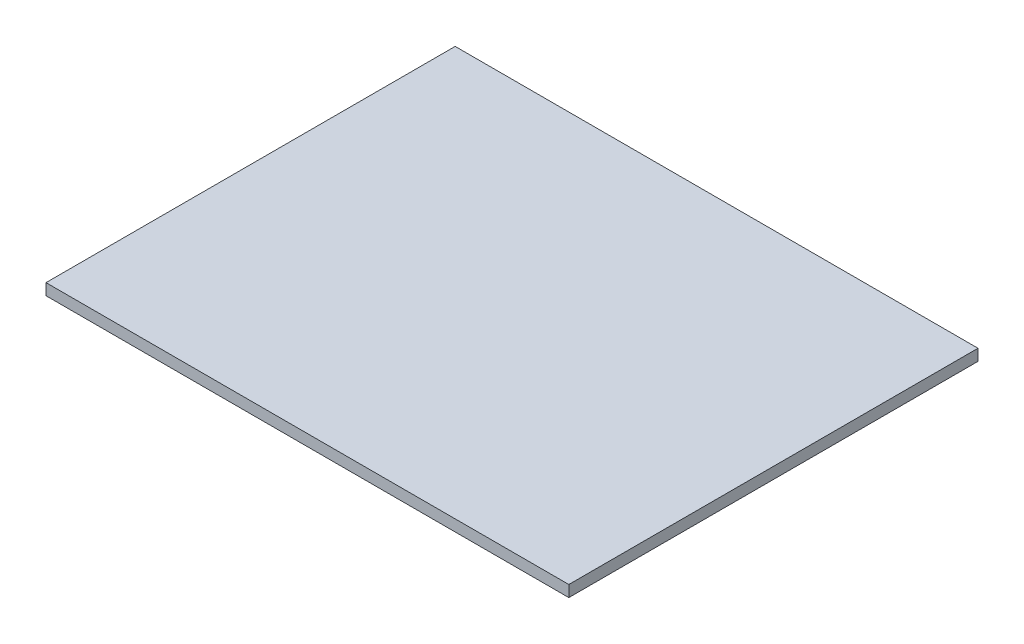
ISO-10303-21;
HEADER;
FILE_DESCRIPTION(('STEP AP214'),'2;1');
FILE_NAME('part.step','',(''),(''),'','','');
FILE_SCHEMA(('AUTOMOTIVE_DESIGN { 1 0 10303 214 1 1 1 1 }'));
ENDSEC;
DATA;
#1=APPLICATION_CONTEXT('core data for automotive mechanical design processes');
#2=APPLICATION_PROTOCOL_DEFINITION('international standard','automotive_design',2000,#1);
#3=PRODUCT_CONTEXT('',#1,'mechanical');
#4=PRODUCT('Part','Part','',(#3));
#5=PRODUCT_RELATED_PRODUCT_CATEGORY('part','',(#4));
#6=PRODUCT_DEFINITION_FORMATION('','',#4);
#7=PRODUCT_DEFINITION_CONTEXT('part definition',#1,'design');
#8=PRODUCT_DEFINITION('design','',#6,#7);
#9=PRODUCT_DEFINITION_SHAPE('','',#8);
#10=(LENGTH_UNIT() NAMED_UNIT(*) SI_UNIT(.MILLI.,.METRE.));
#11=(NAMED_UNIT(*) PLANE_ANGLE_UNIT() SI_UNIT($,.RADIAN.));
#12=(NAMED_UNIT(*) SI_UNIT($,.STERADIAN.) SOLID_ANGLE_UNIT());
#13=UNCERTAINTY_MEASURE_WITH_UNIT(LENGTH_MEASURE(1.E-05),#10,'distance_accuracy_value','');
#14=(GEOMETRIC_REPRESENTATION_CONTEXT(3) GLOBAL_UNCERTAINTY_ASSIGNED_CONTEXT((#13)) GLOBAL_UNIT_ASSIGNED_CONTEXT((#10,
#11,#12)) REPRESENTATION_CONTEXT('',''));
#15=CARTESIAN_POINT('',(0.,0.,0.));
#16=DIRECTION('',(0.,0.,1.));
#17=DIRECTION('',(1.,0.,0.));
#18=AXIS2_PLACEMENT_3D('',#15,#16,#17);
#19=CARTESIAN_POINT('',(292.1,12.7,457.2));
#20=DIRECTION('',(-1.,0.,0.));
#21=DIRECTION('',(0.,0.,1.));
#22=AXIS2_PLACEMENT_3D('',#19,#20,#21);
#23=PLANE('',#22);
#24=DIRECTION('',(0.,0.,-1.));
#25=VECTOR('',#24,1.);
#26=CARTESIAN_POINT('',(292.1,0.,457.2));
#27=LINE('',#26,#25);
#28=CARTESIAN_POINT('',(292.1,0.,457.2));
#29=VERTEX_POINT('',#28);
#30=CARTESIAN_POINT('',(292.1,0.,0.));
#31=VERTEX_POINT('',#30);
#32=EDGE_CURVE('E96',#29,#31,#27,.T.);
#33=ORIENTED_EDGE('',*,*,#32,.T.);
#34=DIRECTION('',(0.,-1.,0.));
#35=VECTOR('',#34,1.);
#36=CARTESIAN_POINT('',(292.1,12.7,0.));
#37=LINE('',#36,#35);
#38=CARTESIAN_POINT('',(292.1,12.7,0.));
#39=VERTEX_POINT('',#38);
#40=EDGE_CURVE('E11',#39,#31,#37,.T.);
#41=ORIENTED_EDGE('',*,*,#40,.F.);
#42=DIRECTION('',(0.,0.,-1.));
#43=VECTOR('',#42,1.);
#44=CARTESIAN_POINT('',(292.1,12.7,457.2));
#45=LINE('',#44,#43);
#46=CARTESIAN_POINT('',(292.1,12.7,457.2));
#47=VERTEX_POINT('',#46);
#48=EDGE_CURVE('E84',#47,#39,#45,.T.);
#49=ORIENTED_EDGE('',*,*,#48,.F.);
#50=DIRECTION('',(0.,-1.,0.));
#51=VECTOR('',#50,1.);
#52=CARTESIAN_POINT('',(292.1,12.7,457.2));
#53=LINE('',#52,#51);
#54=EDGE_CURVE('E92',#47,#29,#53,.T.);
#55=ORIENTED_EDGE('',*,*,#54,.T.);
#56=EDGE_LOOP('',(#33,#41,#49,#55));
#57=FACE_BOUND('',#56,.T.);
#58=ADVANCED_FACE('F33',(#57),#23,.F.);
#59=CARTESIAN_POINT('',(-292.1,12.7,0.));
#60=DIRECTION('',(0.,0.,1.));
#61=DIRECTION('',(1.,0.,0.));
#62=AXIS2_PLACEMENT_3D('',#59,#60,#61);
#63=PLANE('',#62);
#64=DIRECTION('',(-1.,0.,0.));
#65=VECTOR('',#64,1.);
#66=CARTESIAN_POINT('',(-292.1,0.,0.));
#67=LINE('',#66,#65);
#68=CARTESIAN_POINT('',(-292.1,0.,0.));
#69=VERTEX_POINT('',#68);
#70=EDGE_CURVE('E88',#31,#69,#67,.T.);
#71=ORIENTED_EDGE('',*,*,#70,.T.);
#72=DIRECTION('',(0.,-1.,0.));
#73=VECTOR('',#72,1.);
#74=CARTESIAN_POINT('',(-292.1,12.7,0.));
#75=LINE('',#74,#73);
#76=CARTESIAN_POINT('',(-292.1,12.7,0.));
#77=VERTEX_POINT('',#76);
#78=EDGE_CURVE('E41',#77,#69,#75,.T.);
#79=ORIENTED_EDGE('',*,*,#78,.F.);
#80=DIRECTION('',(-1.,0.,0.));
#81=VECTOR('',#80,1.);
#82=CARTESIAN_POINT('',(-292.1,12.7,0.));
#83=LINE('',#82,#81);
#84=EDGE_CURVE('E79',#39,#77,#83,.T.);
#85=ORIENTED_EDGE('',*,*,#84,.F.);
#86=ORIENTED_EDGE('',*,*,#40,.T.);
#87=EDGE_LOOP('',(#71,#79,#85,#86));
#88=FACE_BOUND('',#87,.T.);
#89=ADVANCED_FACE('F87',(#88),#63,.F.);
#90=CARTESIAN_POINT('',(-292.1,12.7,457.2));
#91=DIRECTION('',(1.,0.,0.));
#92=DIRECTION('',(0.,0.,-1.));
#93=AXIS2_PLACEMENT_3D('',#90,#91,#92);
#94=PLANE('',#93);
#95=DIRECTION('',(0.,0.,1.));
#96=VECTOR('',#95,1.);
#97=CARTESIAN_POINT('',(-292.1,0.,457.2));
#98=LINE('',#97,#96);
#99=CARTESIAN_POINT('',(-292.1,0.,457.2));
#100=VERTEX_POINT('',#99);
#101=EDGE_CURVE('E66',#69,#100,#98,.T.);
#102=ORIENTED_EDGE('',*,*,#101,.T.);
#103=DIRECTION('',(0.,-1.,0.));
#104=VECTOR('',#103,1.);
#105=CARTESIAN_POINT('',(-292.1,12.7,457.2));
#106=LINE('',#105,#104);
#107=CARTESIAN_POINT('',(-292.1,12.7,457.2));
#108=VERTEX_POINT('',#107);
#109=EDGE_CURVE('E89',#108,#100,#106,.T.);
#110=ORIENTED_EDGE('',*,*,#109,.F.);
#111=DIRECTION('',(0.,0.,1.));
#112=VECTOR('',#111,1.);
#113=CARTESIAN_POINT('',(-292.1,12.7,457.2));
#114=LINE('',#113,#112);
#115=EDGE_CURVE('E82',#77,#108,#114,.T.);
#116=ORIENTED_EDGE('',*,*,#115,.F.);
#117=ORIENTED_EDGE('',*,*,#78,.T.);
#118=EDGE_LOOP('',(#102,#110,#116,#117));
#119=FACE_BOUND('',#118,.T.);
#120=ADVANCED_FACE('F90',(#119),#94,.F.);
#121=CARTESIAN_POINT('',(-292.1,12.7,457.2));
#122=DIRECTION('',(0.,0.,-1.));
#123=DIRECTION('',(-1.,0.,0.));
#124=AXIS2_PLACEMENT_3D('',#121,#122,#123);
#125=PLANE('',#124);
#126=DIRECTION('',(1.,0.,0.));
#127=VECTOR('',#126,1.);
#128=CARTESIAN_POINT('',(-292.1,0.,457.2));
#129=LINE('',#128,#127);
#130=EDGE_CURVE('E72',#100,#29,#129,.T.);
#131=ORIENTED_EDGE('',*,*,#130,.T.);
#132=ORIENTED_EDGE('',*,*,#54,.F.);
#133=DIRECTION('',(1.,0.,0.));
#134=VECTOR('',#133,1.);
#135=CARTESIAN_POINT('',(-292.1,12.7,457.2));
#136=LINE('',#135,#134);
#137=EDGE_CURVE('E49',#108,#47,#136,.T.);
#138=ORIENTED_EDGE('',*,*,#137,.F.);
#139=ORIENTED_EDGE('',*,*,#109,.T.);
#140=EDGE_LOOP('',(#131,#132,#138,#139));
#141=FACE_BOUND('',#140,.T.);
#142=ADVANCED_FACE('F103',(#141),#125,.F.);
#143=CARTESIAN_POINT('',(0.,12.7,0.));
#144=DIRECTION('',(0.,-1.,0.));
#145=DIRECTION('',(0.,0.,-1.));
#146=AXIS2_PLACEMENT_3D('',#143,#144,#145);
#147=PLANE('',#146);
#148=ORIENTED_EDGE('',*,*,#48,.T.);
#149=ORIENTED_EDGE('',*,*,#84,.T.);
#150=ORIENTED_EDGE('',*,*,#115,.T.);
#151=ORIENTED_EDGE('',*,*,#137,.T.);
#152=EDGE_LOOP('',(#148,#149,#150,#151));
#153=FACE_BOUND('',#152,.T.);
#154=ADVANCED_FACE('F80',(#153),#147,.F.);
#155=CARTESIAN_POINT('',(0.,0.,0.));
#156=DIRECTION('',(0.,-1.,0.));
#157=DIRECTION('',(0.,0.,-1.));
#158=AXIS2_PLACEMENT_3D('',#155,#156,#157);
#159=PLANE('',#158);
#160=ORIENTED_EDGE('',*,*,#32,.F.);
#161=ORIENTED_EDGE('',*,*,#130,.F.);
#162=ORIENTED_EDGE('',*,*,#101,.F.);
#163=ORIENTED_EDGE('',*,*,#70,.F.);
#164=EDGE_LOOP('',(#160,#161,#162,#163));
#165=FACE_BOUND('',#164,.T.);
#166=ADVANCED_FACE('F106',(#165),#159,.T.);
#167=CLOSED_SHELL('',(#58,#89,#120,#142,#154,#166));
#168=MANIFOLD_SOLID_BREP('B2',#167);
#169=ADVANCED_BREP_SHAPE_REPRESENTATION('',(#18,#168),#14);
#170=SHAPE_DEFINITION_REPRESENTATION(#9,#169);
ENDSEC;
END-ISO-10303-21;
